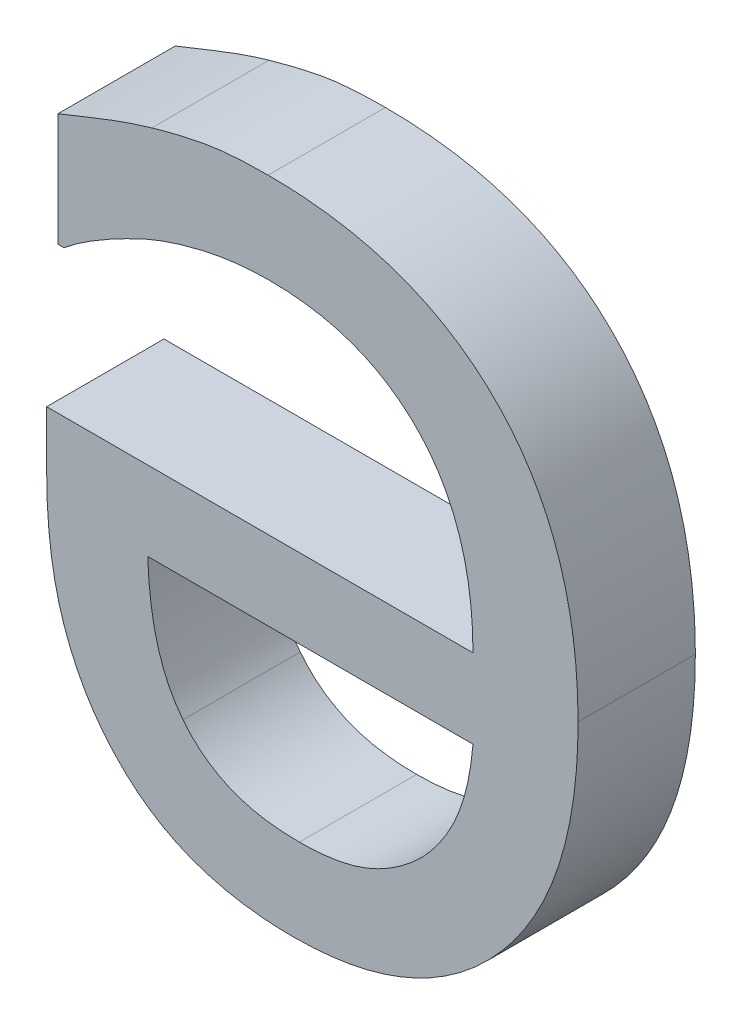
ISO-10303-21;
HEADER;
FILE_DESCRIPTION(('STEP AP214'),'2;1');
FILE_NAME('part.step','',(''),(''),'','','');
FILE_SCHEMA(('AUTOMOTIVE_DESIGN { 1 0 10303 214 1 1 1 1 }'));
ENDSEC;
DATA;
#1=APPLICATION_CONTEXT('core data for automotive mechanical design processes');
#2=APPLICATION_PROTOCOL_DEFINITION('international standard','automotive_design',2000,#1);
#3=PRODUCT_CONTEXT('',#1,'mechanical');
#4=PRODUCT('Part','Part','',(#3));
#5=PRODUCT_RELATED_PRODUCT_CATEGORY('part','',(#4));
#6=PRODUCT_DEFINITION_FORMATION('','',#4);
#7=PRODUCT_DEFINITION_CONTEXT('part definition',#1,'design');
#8=PRODUCT_DEFINITION('design','',#6,#7);
#9=PRODUCT_DEFINITION_SHAPE('','',#8);
#10=(LENGTH_UNIT() NAMED_UNIT(*) SI_UNIT(.MILLI.,.METRE.));
#11=(NAMED_UNIT(*) PLANE_ANGLE_UNIT() SI_UNIT($,.RADIAN.));
#12=(NAMED_UNIT(*) SI_UNIT($,.STERADIAN.) SOLID_ANGLE_UNIT());
#13=UNCERTAINTY_MEASURE_WITH_UNIT(LENGTH_MEASURE(1.E-05),#10,'distance_accuracy_value','');
#14=(GEOMETRIC_REPRESENTATION_CONTEXT(3) GLOBAL_UNCERTAINTY_ASSIGNED_CONTEXT((#13)) GLOBAL_UNIT_ASSIGNED_CONTEXT((#10,
#11,#12)) REPRESENTATION_CONTEXT('',''));
#15=CARTESIAN_POINT('',(0.,0.,0.));
#16=DIRECTION('',(0.,0.,1.));
#17=DIRECTION('',(1.,0.,0.));
#18=AXIS2_PLACEMENT_3D('',#15,#16,#17);
#19=CARTESIAN_POINT('',(-1.006263459883,0.963367809254916,0.));
#20=DIRECTION('',(0.,1.,0.));
#21=DIRECTION('',(-1.,0.,0.));
#22=AXIS2_PLACEMENT_3D('',#19,#20,#21);
#23=PLANE('',#22);
#24=DIRECTION('',(-1.,0.,0.));
#25=VECTOR('',#24,1.);
#26=CARTESIAN_POINT('',(-1.080322980316,0.963367809254916,0.));
#27=LINE('',#26,#25);
#28=CARTESIAN_POINT('',(-1.006263459883,0.963367809254916,0.));
#29=VERTEX_POINT('',#28);
#30=CARTESIAN_POINT('',(-1.283590671454,0.963367809254916,0.));
#31=VERTEX_POINT('',#30);
#32=EDGE_CURVE('E11',#29,#31,#27,.T.);
#33=ORIENTED_EDGE('',*,*,#32,.F.);
#34=DIRECTION('',(0.,0.,1.));
#35=VECTOR('',#34,1.);
#36=CARTESIAN_POINT('',(-1.006263459883,0.963367809254916,0.));
#37=LINE('',#36,#35);
#38=CARTESIAN_POINT('',(-1.006263459883,0.963367809254916,0.1));
#39=VERTEX_POINT('',#38);
#40=EDGE_CURVE('E24',#29,#39,#37,.T.);
#41=ORIENTED_EDGE('',*,*,#40,.T.);
#42=DIRECTION('',(1.,0.,0.));
#43=VECTOR('',#42,1.);
#44=CARTESIAN_POINT('',(-1.080322980316,0.963367809254916,0.1));
#45=LINE('',#44,#43);
#46=CARTESIAN_POINT('',(-1.283590671454,0.963367809254916,0.1));
#47=VERTEX_POINT('',#46);
#48=EDGE_CURVE('E414',#47,#39,#45,.T.);
#49=ORIENTED_EDGE('',*,*,#48,.F.);
#50=DIRECTION('',(0.,0.,1.));
#51=VECTOR('',#50,1.);
#52=CARTESIAN_POINT('',(-1.283590671454,0.963367809254916,0.));
#53=LINE('',#52,#51);
#54=EDGE_CURVE('E408',#31,#47,#53,.T.);
#55=ORIENTED_EDGE('',*,*,#54,.F.);
#56=EDGE_LOOP('',(#33,#41,#49,#55));
#57=FACE_BOUND('',#56,.T.);
#58=ADVANCED_FACE('F17',(#57),#23,.F.);
#59=CARTESIAN_POINT('',(-1.049365439596,0.858448516533894,0.));
#60=CARTESIAN_POINT('',(-1.049365439596,0.858448516533894,0.1));
#61=CARTESIAN_POINT('',(-1.029515843675,0.879432375078099,0.));
#62=CARTESIAN_POINT('',(-1.029515843675,0.879432375078099,0.1));
#63=CARTESIAN_POINT('',(-1.009099116443,0.92990706184659,0.));
#64=CARTESIAN_POINT('',(-1.009099116443,0.92990706184659,0.1));
#65=CARTESIAN_POINT('',(-1.006263459883,0.963367809254916,0.));
#66=CARTESIAN_POINT('',(-1.006263459883,0.963367809254916,0.1));
#67=B_SPLINE_SURFACE_WITH_KNOTS('',2,1,((#59,#60),(#61,#62),(#63,#64),(#65,#66)),.UNSPECIFIED.,
.F.,.F.,.F.,(3,1,3),(2,2),(0.,1.,2.),(0.,0.01),.UNSPECIFIED.);
#68=CARTESIAN_POINT('',(-1.049365439596,0.858448516533894,0.));
#69=CARTESIAN_POINT('',(-1.029515843675,0.879432375078099,0.));
#70=CARTESIAN_POINT('',(-1.009099116443,0.92990706184659,0.));
#71=CARTESIAN_POINT('',(-1.006263459883,0.963367809254916,0.));
#72=B_SPLINE_CURVE_WITH_KNOTS('',2,(#68,#69,#70,#71),.UNSPECIFIED.,.F.,.F.,(3,1,3),(0.,1.,2.),.UNSPECIFIED.);
#73=CARTESIAN_POINT('',(-1.049365439596,0.858448516533894,0.));
#74=VERTEX_POINT('',#73);
#75=EDGE_CURVE('E404',#74,#29,#72,.T.);
#76=DIRECTION('',(0.,0.,1.));
#77=VECTOR('',#76,1.);
#78=CARTESIAN_POINT('',(-1.049365439596,0.858448516533894,0.));
#79=LINE('',#78,#77);
#80=CARTESIAN_POINT('',(-1.049365439596,0.858448516533894,0.1));
#81=VERTEX_POINT('',#80);
#82=EDGE_CURVE('E398',#74,#81,#79,.T.);
#83=CARTESIAN_POINT('',(-1.006263459883,0.963367809254916,0.1));
#84=CARTESIAN_POINT('',(-1.009099116443,0.92990706184659,0.1));
#85=CARTESIAN_POINT('',(-1.029515843675,0.879432375078099,0.1));
#86=CARTESIAN_POINT('',(-1.049365439596,0.858448516533894,0.1));
#87=B_SPLINE_CURVE_WITH_KNOTS('',2,(#83,#84,#85,#86),.UNSPECIFIED.,.F.,.F.,(3,1,3),(-2.,-1.,0.),.UNSPECIFIED.);
#88=EDGE_CURVE('E391',#39,#81,#87,.T.);
#89=ORIENTED_EDGE('',*,*,#75,.F.);
#90=ORIENTED_EDGE('',*,*,#82,.T.);
#91=ORIENTED_EDGE('',*,*,#88,.F.);
#92=ORIENTED_EDGE('',*,*,#40,.F.);
#93=EDGE_LOOP('',(#89,#90,#91,#92));
#94=FACE_BOUND('',#93,.T.);
#95=ADVANCED_FACE('F420',(#94),#67,.F.);
#96=CARTESIAN_POINT('',(-1.154284732317,0.817047930757491,0.));
#97=CARTESIAN_POINT('',(-1.154284732317,0.817047930757491,0.1));
#98=CARTESIAN_POINT('',(-1.119122590972,0.817047930757491,0.));
#99=CARTESIAN_POINT('',(-1.119122590972,0.817047930757491,0.1));
#100=CARTESIAN_POINT('',(-1.069782166828,0.838031789301695,0.));
#101=CARTESIAN_POINT('',(-1.069782166828,0.838031789301695,0.1));
#102=CARTESIAN_POINT('',(-1.049365439596,0.858448516533894,0.));
#103=CARTESIAN_POINT('',(-1.049365439596,0.858448516533894,0.1));
#104=B_SPLINE_SURFACE_WITH_KNOTS('',2,1,((#96,#97),(#98,#99),(#100,#101),(#102,#103)),
.UNSPECIFIED.,.F.,.F.,.F.,(3,1,3),(2,2),(0.,1.,2.),(0.,0.01),.UNSPECIFIED.);
#105=CARTESIAN_POINT('',(-1.154284732317,0.817047930757491,0.));
#106=CARTESIAN_POINT('',(-1.119122590972,0.817047930757491,0.));
#107=CARTESIAN_POINT('',(-1.069782166828,0.838031789301695,0.));
#108=CARTESIAN_POINT('',(-1.049365439596,0.858448516533894,0.));
#109=B_SPLINE_CURVE_WITH_KNOTS('',2,(#105,#106,#107,#108),.UNSPECIFIED.,.F.,.F.,(3,1,3),(0.,1.,
2.),.UNSPECIFIED.);
#110=CARTESIAN_POINT('',(-1.154284732317,0.817047930757491,0.));
#111=VERTEX_POINT('',#110);
#112=EDGE_CURVE('E386',#111,#74,#109,.T.);
#113=DIRECTION('',(0.,0.,1.));
#114=VECTOR('',#113,1.);
#115=CARTESIAN_POINT('',(-1.154284732317,0.817047930757491,0.));
#116=LINE('',#115,#114);
#117=CARTESIAN_POINT('',(-1.154284732317,0.817047930757491,0.1));
#118=VERTEX_POINT('',#117);
#119=EDGE_CURVE('E380',#111,#118,#116,.T.);
#120=CARTESIAN_POINT('',(-1.049365439596,0.858448516533894,0.1));
#121=CARTESIAN_POINT('',(-1.069782166828,0.838031789301695,0.1));
#122=CARTESIAN_POINT('',(-1.119122590972,0.817047930757491,0.1));
#123=CARTESIAN_POINT('',(-1.154284732317,0.817047930757491,0.1));
#124=B_SPLINE_CURVE_WITH_KNOTS('',2,(#120,#121,#122,#123),.UNSPECIFIED.,.F.,.F.,(3,1,3),(-2.,
-1.,0.),.UNSPECIFIED.);
#125=EDGE_CURVE('E373',#81,#118,#124,.T.);
#126=ORIENTED_EDGE('',*,*,#112,.F.);
#127=ORIENTED_EDGE('',*,*,#119,.T.);
#128=ORIENTED_EDGE('',*,*,#125,.F.);
#129=ORIENTED_EDGE('',*,*,#82,.F.);
#130=EDGE_LOOP('',(#126,#127,#128,#129));
#131=FACE_BOUND('',#130,.T.);
#132=ADVANCED_FACE('F424',(#131),#104,.F.);
#133=CARTESIAN_POINT('',(-1.253532711918,0.857881385221889,0.));
#134=CARTESIAN_POINT('',(-1.253532711918,0.857881385221889,0.1));
#135=CARTESIAN_POINT('',(-1.238220166493,0.838031789301695,0.));
#136=CARTESIAN_POINT('',(-1.238220166493,0.838031789301695,0.1));
#137=CARTESIAN_POINT('',(-1.190014004973,0.817047930757491,0.));
#138=CARTESIAN_POINT('',(-1.190014004973,0.817047930757491,0.1));
#139=CARTESIAN_POINT('',(-1.154284732317,0.817047930757491,0.));
#140=CARTESIAN_POINT('',(-1.154284732317,0.817047930757491,0.1));
#141=B_SPLINE_SURFACE_WITH_KNOTS('',2,1,((#133,#134),(#135,#136),(#137,#138),(#139,#140)),
.UNSPECIFIED.,.F.,.F.,.F.,(3,1,3),(2,2),(0.,1.,2.),(0.,0.01),.UNSPECIFIED.);
#142=CARTESIAN_POINT('',(-1.253532711918,0.857881385221889,0.));
#143=CARTESIAN_POINT('',(-1.238220166493,0.838031789301695,0.));
#144=CARTESIAN_POINT('',(-1.190014004973,0.817047930757491,0.));
#145=CARTESIAN_POINT('',(-1.154284732317,0.817047930757491,0.));
#146=B_SPLINE_CURVE_WITH_KNOTS('',2,(#142,#143,#144,#145),.UNSPECIFIED.,.F.,.F.,(3,1,3),(0.,1.,
2.),.UNSPECIFIED.);
#147=CARTESIAN_POINT('',(-1.253532711918,0.857881385221889,0.));
#148=VERTEX_POINT('',#147);
#149=EDGE_CURVE('E368',#148,#111,#146,.T.);
#150=DIRECTION('',(0.,0.,1.));
#151=VECTOR('',#150,1.);
#152=CARTESIAN_POINT('',(-1.253532711918,0.857881385221889,0.));
#153=LINE('',#152,#151);
#154=CARTESIAN_POINT('',(-1.253532711918,0.857881385221889,0.1));
#155=VERTEX_POINT('',#154);
#156=EDGE_CURVE('E362',#148,#155,#153,.T.);
#157=CARTESIAN_POINT('',(-1.154284732317,0.817047930757491,0.1));
#158=CARTESIAN_POINT('',(-1.190014004973,0.817047930757491,0.1));
#159=CARTESIAN_POINT('',(-1.238220166493,0.838031789301695,0.1));
#160=CARTESIAN_POINT('',(-1.253532711918,0.857881385221889,0.1));
#161=B_SPLINE_CURVE_WITH_KNOTS('',2,(#157,#158,#159,#160),.UNSPECIFIED.,.F.,.F.,(3,1,3),(-2.,
-1.,0.),.UNSPECIFIED.);
#162=EDGE_CURVE('E355',#118,#155,#161,.T.);
#163=ORIENTED_EDGE('',*,*,#149,.F.);
#164=ORIENTED_EDGE('',*,*,#156,.T.);
#165=ORIENTED_EDGE('',*,*,#162,.F.);
#166=ORIENTED_EDGE('',*,*,#119,.F.);
#167=EDGE_LOOP('',(#163,#164,#165,#166));
#168=FACE_BOUND('',#167,.T.);
#169=ADVANCED_FACE('F428',(#168),#141,.F.);
#170=CARTESIAN_POINT('',(-1.283590671454,0.963367809254916,0.));
#171=CARTESIAN_POINT('',(-1.283590671454,0.963367809254916,0.1));
#172=CARTESIAN_POINT('',(-1.28245640883,0.927638536598568,0.));
#173=CARTESIAN_POINT('',(-1.28245640883,0.927638536598568,0.1));
#174=CARTESIAN_POINT('',(-1.267710994718,0.87546245589406,0.));
#175=CARTESIAN_POINT('',(-1.267710994718,0.87546245589406,0.1));
#176=CARTESIAN_POINT('',(-1.253532711918,0.857881385221889,0.));
#177=CARTESIAN_POINT('',(-1.253532711918,0.857881385221889,0.1));
#178=B_SPLINE_SURFACE_WITH_KNOTS('',2,1,((#170,#171),(#172,#173),(#174,#175),(#176,#177)),
.UNSPECIFIED.,.F.,.F.,.F.,(3,1,3),(2,2),(0.,1.,2.),(0.,0.01),.UNSPECIFIED.);
#179=CARTESIAN_POINT('',(-1.283590671454,0.963367809254916,0.));
#180=CARTESIAN_POINT('',(-1.28245640883,0.927638536598568,0.));
#181=CARTESIAN_POINT('',(-1.267710994718,0.87546245589406,0.));
#182=CARTESIAN_POINT('',(-1.253532711918,0.857881385221889,0.));
#183=B_SPLINE_CURVE_WITH_KNOTS('',2,(#179,#180,#181,#182),.UNSPECIFIED.,.F.,.F.,(3,1,3),(0.,1.,
2.),.UNSPECIFIED.);
#184=EDGE_CURVE('E348',#31,#148,#183,.T.);
#185=CARTESIAN_POINT('',(-1.253532711918,0.857881385221889,0.1));
#186=CARTESIAN_POINT('',(-1.267710994718,0.87546245589406,0.1));
#187=CARTESIAN_POINT('',(-1.28245640883,0.927638536598568,0.1));
#188=CARTESIAN_POINT('',(-1.283590671454,0.963367809254916,0.1));
#189=B_SPLINE_CURVE_WITH_KNOTS('',2,(#185,#186,#187,#188),.UNSPECIFIED.,.F.,.F.,(3,1,3),(-2.,
-1.,0.),.UNSPECIFIED.);
#190=EDGE_CURVE('E340',#155,#47,#189,.T.);
#191=ORIENTED_EDGE('',*,*,#184,.F.);
#192=ORIENTED_EDGE('',*,*,#54,.T.);
#193=ORIENTED_EDGE('',*,*,#190,.F.);
#194=ORIENTED_EDGE('',*,*,#156,.F.);
#195=EDGE_LOOP('',(#191,#192,#193,#194));
#196=FACE_BOUND('',#195,.T.);
#197=ADVANCED_FACE('F431',(#196),#178,.F.);
#198=CARTESIAN_POINT('',(-1.159388914125,0.744455122820784,0.));
#199=CARTESIAN_POINT('',(-1.159388914125,0.744455122820784,0.1));
#200=CARTESIAN_POINT('',(-1.051066833532,0.744455122820784,0.));
#201=CARTESIAN_POINT('',(-1.051066833532,0.744455122820784,0.1));
#202=CARTESIAN_POINT('',(-0.916656712586257,0.896446314438265,0.));
#203=CARTESIAN_POINT('',(-0.916656712586257,0.896446314438265,0.1));
#204=CARTESIAN_POINT('',(-0.916656712586257,1.024617990952,0.));
#205=CARTESIAN_POINT('',(-0.916656712586257,1.024617990952,0.1));
#206=B_SPLINE_SURFACE_WITH_KNOTS('',2,1,((#198,#199),(#200,#201),(#202,#203),(#204,#205)),
.UNSPECIFIED.,.F.,.F.,.F.,(3,1,3),(2,2),(-2.,-1.,0.),(0.,0.01),.UNSPECIFIED.);
#207=CARTESIAN_POINT('',(-0.916656712586257,1.024617990952,0.));
#208=CARTESIAN_POINT('',(-0.916656712586257,0.896446314438265,0.));
#209=CARTESIAN_POINT('',(-1.051066833532,0.744455122820784,0.));
#210=CARTESIAN_POINT('',(-1.159388914125,0.744455122820784,0.));
#211=B_SPLINE_CURVE_WITH_KNOTS('',2,(#207,#208,#209,#210),.UNSPECIFIED.,.F.,.F.,(3,1,3),(0.,1.,
2.),.UNSPECIFIED.);
#212=CARTESIAN_POINT('',(-0.916656712586257,1.024617990952,0.));
#213=VERTEX_POINT('',#212);
#214=CARTESIAN_POINT('',(-1.159388914125,0.744455122820784,0.));
#215=VERTEX_POINT('',#214);
#216=EDGE_CURVE('E336',#213,#215,#211,.T.);
#217=DIRECTION('',(0.,0.,1.));
#218=VECTOR('',#217,1.);
#219=CARTESIAN_POINT('',(-0.916656712586257,1.024617990952,0.));
#220=LINE('',#219,#218);
#221=CARTESIAN_POINT('',(-0.916656712586257,1.024617990952,0.1));
#222=VERTEX_POINT('',#221);
#223=EDGE_CURVE('E331',#213,#222,#220,.T.);
#224=CARTESIAN_POINT('',(-1.159388914125,0.744455122820784,0.1));
#225=CARTESIAN_POINT('',(-1.051066833532,0.744455122820784,0.1));
#226=CARTESIAN_POINT('',(-0.916656712586257,0.896446314438265,0.1));
#227=CARTESIAN_POINT('',(-0.916656712586257,1.024617990952,0.1));
#228=B_SPLINE_CURVE_WITH_KNOTS('',2,(#224,#225,#226,#227),.UNSPECIFIED.,.F.,.F.,(3,1,3),(-2.,
-1.,0.),.UNSPECIFIED.);
#229=CARTESIAN_POINT('',(-1.159388914125,0.744455122820784,0.1));
#230=VERTEX_POINT('',#229);
#231=EDGE_CURVE('E164',#230,#222,#228,.T.);
#232=DIRECTION('',(0.,0.,1.));
#233=VECTOR('',#232,1.);
#234=CARTESIAN_POINT('',(-1.159388914125,0.744455122820784,0.));
#235=LINE('',#234,#233);
#236=EDGE_CURVE('E322',#215,#230,#235,.T.);
#237=ORIENTED_EDGE('',*,*,#216,.F.);
#238=ORIENTED_EDGE('',*,*,#223,.T.);
#239=ORIENTED_EDGE('',*,*,#231,.F.);
#240=ORIENTED_EDGE('',*,*,#236,.F.);
#241=EDGE_LOOP('',(#237,#238,#239,#240));
#242=FACE_BOUND('',#241,.T.);
#243=ADVANCED_FACE('F479',(#242),#206,.T.);
#244=CARTESIAN_POINT('',(-1.311380105742,0.802869647957353,0.));
#245=CARTESIAN_POINT('',(-1.311380105742,0.802869647957353,0.1));
#246=CARTESIAN_POINT('',(-1.283590671454,0.77281168842106,0.));
#247=CARTESIAN_POINT('',(-1.283590671454,0.77281168842106,0.1));
#248=CARTESIAN_POINT('',(-1.208162206957,0.744455122820784,0.));
#249=CARTESIAN_POINT('',(-1.208162206957,0.744455122820784,0.1));
#250=CARTESIAN_POINT('',(-1.159388914125,0.744455122820784,0.));
#251=CARTESIAN_POINT('',(-1.159388914125,0.744455122820784,0.1));
#252=B_SPLINE_SURFACE_WITH_KNOTS('',2,1,((#244,#245),(#246,#247),(#248,#249),(#250,#251)),
.UNSPECIFIED.,.F.,.F.,.F.,(3,1,3),(2,2),(-2.,-1.,0.),(0.,0.01),.UNSPECIFIED.);
#253=CARTESIAN_POINT('',(-1.159388914125,0.744455122820784,0.));
#254=CARTESIAN_POINT('',(-1.208162206957,0.744455122820784,0.));
#255=CARTESIAN_POINT('',(-1.283590671454,0.77281168842106,0.));
#256=CARTESIAN_POINT('',(-1.311380105742,0.802869647957353,0.));
#257=B_SPLINE_CURVE_WITH_KNOTS('',2,(#253,#254,#255,#256),.UNSPECIFIED.,.F.,.F.,(3,1,3),(0.,1.,
2.),.UNSPECIFIED.);
#258=CARTESIAN_POINT('',(-1.311380105742,0.802869647957353,0.));
#259=VERTEX_POINT('',#258);
#260=EDGE_CURVE('E315',#215,#259,#257,.T.);
#261=CARTESIAN_POINT('',(-1.311380105742,0.802869647957353,0.1));
#262=CARTESIAN_POINT('',(-1.283590671454,0.77281168842106,0.1));
#263=CARTESIAN_POINT('',(-1.208162206957,0.744455122820784,0.1));
#264=CARTESIAN_POINT('',(-1.159388914125,0.744455122820784,0.1));
#265=B_SPLINE_CURVE_WITH_KNOTS('',2,(#261,#262,#263,#264),.UNSPECIFIED.,.F.,.F.,(3,1,3),(-2.,
-1.,0.),.UNSPECIFIED.);
#266=CARTESIAN_POINT('',(-1.311380105742,0.802869647957353,0.1));
#267=VERTEX_POINT('',#266);
#268=EDGE_CURVE('E311',#267,#230,#265,.T.);
#269=DIRECTION('',(0.,0.,1.));
#270=VECTOR('',#269,1.);
#271=CARTESIAN_POINT('',(-1.311380105742,0.802869647957353,0.));
#272=LINE('',#271,#270);
#273=EDGE_CURVE('E305',#259,#267,#272,.T.);
#274=ORIENTED_EDGE('',*,*,#260,.F.);
#275=ORIENTED_EDGE('',*,*,#236,.T.);
#276=ORIENTED_EDGE('',*,*,#268,.F.);
#277=ORIENTED_EDGE('',*,*,#273,.F.);
#278=EDGE_LOOP('',(#274,#275,#276,#277));
#279=FACE_BOUND('',#278,.T.);
#280=ADVANCED_FACE('F489',(#279),#252,.T.);
#281=CARTESIAN_POINT('',(-1.369794630879,0.982650273863104,0.));
#282=CARTESIAN_POINT('',(-1.369794630879,0.982650273863104,0.1));
#283=CARTESIAN_POINT('',(-1.369794630879,0.919698698230491,0.));
#284=CARTESIAN_POINT('',(-1.369794630879,0.919698698230491,0.1));
#285=CARTESIAN_POINT('',(-1.339736671342,0.832927607493646,0.));
#286=CARTESIAN_POINT('',(-1.339736671342,0.832927607493646,0.1));
#287=CARTESIAN_POINT('',(-1.311380105742,0.802869647957353,0.));
#288=CARTESIAN_POINT('',(-1.311380105742,0.802869647957353,0.1));
#289=B_SPLINE_SURFACE_WITH_KNOTS('',2,1,((#281,#282),(#283,#284),(#285,#286),(#287,#288)),
.UNSPECIFIED.,.F.,.F.,.F.,(3,1,3),(2,2),(-2.,-1.,0.),(0.,0.01),.UNSPECIFIED.);
#290=CARTESIAN_POINT('',(-1.311380105742,0.802869647957353,0.));
#291=CARTESIAN_POINT('',(-1.339736671342,0.832927607493646,0.));
#292=CARTESIAN_POINT('',(-1.369794630879,0.919698698230491,0.));
#293=CARTESIAN_POINT('',(-1.369794630879,0.982650273863104,0.));
#294=B_SPLINE_CURVE_WITH_KNOTS('',2,(#290,#291,#292,#293),.UNSPECIFIED.,.F.,.F.,(3,1,3),(0.,1.,
2.),.UNSPECIFIED.);
#295=CARTESIAN_POINT('',(-1.369794630879,0.982650273863104,0.));
#296=VERTEX_POINT('',#295);
#297=EDGE_CURVE('E298',#259,#296,#294,.T.);
#298=CARTESIAN_POINT('',(-1.369794630879,0.982650273863104,0.1));
#299=CARTESIAN_POINT('',(-1.369794630879,0.919698698230491,0.1));
#300=CARTESIAN_POINT('',(-1.339736671342,0.832927607493646,0.1));
#301=CARTESIAN_POINT('',(-1.311380105742,0.802869647957353,0.1));
#302=B_SPLINE_CURVE_WITH_KNOTS('',2,(#298,#299,#300,#301),.UNSPECIFIED.,.F.,.F.,(3,1,3),(-2.,
-1.,0.),.UNSPECIFIED.);
#303=CARTESIAN_POINT('',(-1.369794630879,0.982650273863104,0.1));
#304=VERTEX_POINT('',#303);
#305=EDGE_CURVE('E293',#304,#267,#302,.T.);
#306=DIRECTION('',(0.,0.,1.));
#307=VECTOR('',#306,1.);
#308=CARTESIAN_POINT('',(-1.369794630879,0.982650273863104,0.));
#309=LINE('',#308,#307);
#310=EDGE_CURVE('E290',#296,#304,#309,.T.);
#311=ORIENTED_EDGE('',*,*,#297,.F.);
#312=ORIENTED_EDGE('',*,*,#273,.T.);
#313=ORIENTED_EDGE('',*,*,#305,.F.);
#314=ORIENTED_EDGE('',*,*,#310,.F.);
#315=EDGE_LOOP('',(#311,#312,#313,#314));
#316=FACE_BOUND('',#315,.T.);
#317=ADVANCED_FACE('F500',(#316),#289,.T.);
#318=CARTESIAN_POINT('',(-1.369794630879,1.030856435384,0.));
#319=DIRECTION('',(-1.,0.,0.));
#320=DIRECTION('',(0.,-1.,0.));
#321=AXIS2_PLACEMENT_3D('',#318,#319,#320);
#322=PLANE('',#321);
#323=DIRECTION('',(0.,1.,0.));
#324=VECTOR('',#323,1.);
#325=CARTESIAN_POINT('',(-1.369794630879,0.982650273863104,0.));
#326=LINE('',#325,#324);
#327=CARTESIAN_POINT('',(-1.369794630879,1.030856435384,0.));
#328=VERTEX_POINT('',#327);
#329=EDGE_CURVE('E288',#296,#328,#326,.T.);
#330=ORIENTED_EDGE('',*,*,#329,.F.);
#331=ORIENTED_EDGE('',*,*,#310,.T.);
#332=DIRECTION('',(0.,-1.,0.));
#333=VECTOR('',#332,1.);
#334=CARTESIAN_POINT('',(-1.369794630879,0.982650273863104,0.1));
#335=LINE('',#334,#333);
#336=CARTESIAN_POINT('',(-1.369794630879,1.030856435384,0.1));
#337=VERTEX_POINT('',#336);
#338=EDGE_CURVE('E285',#337,#304,#335,.T.);
#339=ORIENTED_EDGE('',*,*,#338,.F.);
#340=DIRECTION('',(0.,0.,1.));
#341=VECTOR('',#340,1.);
#342=CARTESIAN_POINT('',(-1.369794630879,1.030856435384,0.));
#343=LINE('',#342,#341);
#344=EDGE_CURVE('E282',#328,#337,#343,.T.);
#345=ORIENTED_EDGE('',*,*,#344,.F.);
#346=EDGE_LOOP('',(#330,#331,#339,#345));
#347=FACE_BOUND('',#346,.T.);
#348=ADVANCED_FACE('F511',(#347),#322,.T.);
#349=CARTESIAN_POINT('',(-1.006263459883,1.030856435384,0.));
#350=DIRECTION('',(0.,1.,0.));
#351=DIRECTION('',(-1.,0.,0.));
#352=AXIS2_PLACEMENT_3D('',#349,#350,#351);
#353=PLANE('',#352);
#354=DIRECTION('',(1.,0.,0.));
#355=VECTOR('',#354,1.);
#356=CARTESIAN_POINT('',(-1.369794630879,1.030856435384,0.));
#357=LINE('',#356,#355);
#358=CARTESIAN_POINT('',(-1.006263459883,1.030856435384,0.));
#359=VERTEX_POINT('',#358);
#360=EDGE_CURVE('E280',#328,#359,#357,.T.);
#361=ORIENTED_EDGE('',*,*,#360,.F.);
#362=ORIENTED_EDGE('',*,*,#344,.T.);
#363=DIRECTION('',(-1.,0.,0.));
#364=VECTOR('',#363,1.);
#365=CARTESIAN_POINT('',(-1.369794630879,1.030856435384,0.1));
#366=LINE('',#365,#364);
#367=CARTESIAN_POINT('',(-1.006263459883,1.030856435384,0.1));
#368=VERTEX_POINT('',#367);
#369=EDGE_CURVE('E277',#368,#337,#366,.T.);
#370=ORIENTED_EDGE('',*,*,#369,.F.);
#371=DIRECTION('',(0.,0.,1.));
#372=VECTOR('',#371,1.);
#373=CARTESIAN_POINT('',(-1.006263459883,1.030856435384,0.));
#374=LINE('',#373,#372);
#375=EDGE_CURVE('E271',#359,#368,#374,.T.);
#376=ORIENTED_EDGE('',*,*,#375,.F.);
#377=EDGE_LOOP('',(#361,#362,#370,#376));
#378=FACE_BOUND('',#377,.T.);
#379=ADVANCED_FACE('F520',(#378),#353,.T.);
#380=CARTESIAN_POINT('',(-1.179805641357,1.219144030969,0.));
#381=CARTESIAN_POINT('',(-1.179805641357,1.219144030969,0.1));
#382=CARTESIAN_POINT('',(-1.098138732428,1.219144030969,0.));
#383=CARTESIAN_POINT('',(-1.098138732428,1.219144030969,0.1));
#384=CARTESIAN_POINT('',(-1.006263459883,1.122164576616,0.));
#385=CARTESIAN_POINT('',(-1.006263459883,1.122164576616,0.1));
#386=CARTESIAN_POINT('',(-1.006263459883,1.030856435384,0.));
#387=CARTESIAN_POINT('',(-1.006263459883,1.030856435384,0.1));
#388=B_SPLINE_SURFACE_WITH_KNOTS('',2,1,((#380,#381),(#382,#383),(#384,#385),(#386,#387)),
.UNSPECIFIED.,.F.,.F.,.F.,(3,1,3),(2,2),(-2.,-1.,0.),(0.,0.01),.UNSPECIFIED.);
#389=CARTESIAN_POINT('',(-1.006263459883,1.030856435384,0.));
#390=CARTESIAN_POINT('',(-1.006263459883,1.122164576616,0.));
#391=CARTESIAN_POINT('',(-1.098138732428,1.219144030969,0.));
#392=CARTESIAN_POINT('',(-1.179805641357,1.219144030969,0.));
#393=B_SPLINE_CURVE_WITH_KNOTS('',2,(#389,#390,#391,#392),.UNSPECIFIED.,.F.,.F.,(3,1,3),(0.,1.,
2.),.UNSPECIFIED.);
#394=CARTESIAN_POINT('',(-1.179805641357,1.219144030969,0.));
#395=VERTEX_POINT('',#394);
#396=EDGE_CURVE('E264',#359,#395,#393,.T.);
#397=CARTESIAN_POINT('',(-1.179805641357,1.219144030969,0.1));
#398=CARTESIAN_POINT('',(-1.098138732428,1.219144030969,0.1));
#399=CARTESIAN_POINT('',(-1.006263459883,1.122164576616,0.1));
#400=CARTESIAN_POINT('',(-1.006263459883,1.030856435384,0.1));
#401=B_SPLINE_CURVE_WITH_KNOTS('',2,(#397,#398,#399,#400),.UNSPECIFIED.,.F.,.F.,(3,1,3),(-2.,
-1.,0.),.UNSPECIFIED.);
#402=CARTESIAN_POINT('',(-1.179805641357,1.219144030969,0.1));
#403=VERTEX_POINT('',#402);
#404=EDGE_CURVE('E259',#403,#368,#401,.T.);
#405=DIRECTION('',(0.,0.,1.));
#406=VECTOR('',#405,1.);
#407=CARTESIAN_POINT('',(-1.179805641357,1.219144030969,0.));
#408=LINE('',#407,#406);
#409=EDGE_CURVE('E253',#395,#403,#408,.T.);
#410=ORIENTED_EDGE('',*,*,#396,.F.);
#411=ORIENTED_EDGE('',*,*,#375,.T.);
#412=ORIENTED_EDGE('',*,*,#404,.F.);
#413=ORIENTED_EDGE('',*,*,#409,.F.);
#414=EDGE_LOOP('',(#410,#411,#412,#413));
#415=FACE_BOUND('',#414,.T.);
#416=ADVANCED_FACE('F524',(#415),#388,.T.);
#417=CARTESIAN_POINT('',(-1.287560590638,1.195891647177,0.));
#418=CARTESIAN_POINT('',(-1.287560590638,1.195891647177,0.1));
#419=CARTESIAN_POINT('',(-1.264875338158,1.206100010793,0.));
#420=CARTESIAN_POINT('',(-1.264875338158,1.206100010793,0.1));
#421=CARTESIAN_POINT('',(-1.208729338269,1.219144030969,0.));
#422=CARTESIAN_POINT('',(-1.208729338269,1.219144030969,0.1));
#423=CARTESIAN_POINT('',(-1.179805641357,1.219144030969,0.));
#424=CARTESIAN_POINT('',(-1.179805641357,1.219144030969,0.1));
#425=B_SPLINE_SURFACE_WITH_KNOTS('',2,1,((#417,#418),(#419,#420),(#421,#422),(#423,#424)),
.UNSPECIFIED.,.F.,.F.,.F.,(3,1,3),(2,2),(-2.,-1.,0.),(0.,0.01),.UNSPECIFIED.);
#426=CARTESIAN_POINT('',(-1.179805641357,1.219144030969,0.));
#427=CARTESIAN_POINT('',(-1.208729338269,1.219144030969,0.));
#428=CARTESIAN_POINT('',(-1.264875338158,1.206100010793,0.));
#429=CARTESIAN_POINT('',(-1.287560590638,1.195891647177,0.));
#430=B_SPLINE_CURVE_WITH_KNOTS('',2,(#426,#427,#428,#429),.UNSPECIFIED.,.F.,.F.,(3,1,3),(0.,1.,
2.),.UNSPECIFIED.);
#431=CARTESIAN_POINT('',(-1.287560590638,1.195891647177,0.));
#432=VERTEX_POINT('',#431);
#433=EDGE_CURVE('E246',#395,#432,#430,.T.);
#434=CARTESIAN_POINT('',(-1.287560590638,1.195891647177,0.1));
#435=CARTESIAN_POINT('',(-1.264875338158,1.206100010793,0.1));
#436=CARTESIAN_POINT('',(-1.208729338269,1.219144030969,0.1));
#437=CARTESIAN_POINT('',(-1.179805641357,1.219144030969,0.1));
#438=B_SPLINE_CURVE_WITH_KNOTS('',2,(#434,#435,#436,#437),.UNSPECIFIED.,.F.,.F.,(3,1,3),(-2.,
-1.,0.),.UNSPECIFIED.);
#439=CARTESIAN_POINT('',(-1.287560590638,1.195891647177,0.1));
#440=VERTEX_POINT('',#439);
#441=EDGE_CURVE('E241',#440,#403,#438,.T.);
#442=DIRECTION('',(0.,0.,1.));
#443=VECTOR('',#442,1.);
#444=CARTESIAN_POINT('',(-1.287560590638,1.195891647177,0.));
#445=LINE('',#444,#443);
#446=EDGE_CURVE('E235',#432,#440,#445,.T.);
#447=ORIENTED_EDGE('',*,*,#433,.F.);
#448=ORIENTED_EDGE('',*,*,#409,.T.);
#449=ORIENTED_EDGE('',*,*,#441,.F.);
#450=ORIENTED_EDGE('',*,*,#446,.F.);
#451=EDGE_LOOP('',(#447,#448,#449,#450));
#452=FACE_BOUND('',#451,.T.);
#453=ADVANCED_FACE('F530',(#452),#425,.T.);
#454=CARTESIAN_POINT('',(-1.355049216767,1.155625324025,0.));
#455=CARTESIAN_POINT('',(-1.355049216767,1.155625324025,0.1));
#456=CARTESIAN_POINT('',(-1.344273721838,1.164699425017,0.));
#457=CARTESIAN_POINT('',(-1.344273721838,1.164699425017,0.1));
#458=CARTESIAN_POINT('',(-1.311380105742,1.184549020937,0.));
#459=CARTESIAN_POINT('',(-1.311380105742,1.184549020937,0.1));
#460=CARTESIAN_POINT('',(-1.287560590638,1.195891647177,0.));
#461=CARTESIAN_POINT('',(-1.287560590638,1.195891647177,0.1));
#462=B_SPLINE_SURFACE_WITH_KNOTS('',2,1,((#454,#455),(#456,#457),(#458,#459),(#460,#461)),
.UNSPECIFIED.,.F.,.F.,.F.,(3,1,3),(2,2),(-2.,-1.,0.),(0.,0.01),.UNSPECIFIED.);
#463=CARTESIAN_POINT('',(-1.287560590638,1.195891647177,0.));
#464=CARTESIAN_POINT('',(-1.311380105742,1.184549020937,0.));
#465=CARTESIAN_POINT('',(-1.344273721838,1.164699425017,0.));
#466=CARTESIAN_POINT('',(-1.355049216767,1.155625324025,0.));
#467=B_SPLINE_CURVE_WITH_KNOTS('',2,(#463,#464,#465,#466),.UNSPECIFIED.,.F.,.F.,(3,1,3),(0.,1.,
2.),.UNSPECIFIED.);
#468=CARTESIAN_POINT('',(-1.355049216767,1.155625324025,0.));
#469=VERTEX_POINT('',#468);
#470=EDGE_CURVE('E228',#432,#469,#467,.T.);
#471=CARTESIAN_POINT('',(-1.355049216767,1.155625324025,0.1));
#472=CARTESIAN_POINT('',(-1.344273721838,1.164699425017,0.1));
#473=CARTESIAN_POINT('',(-1.311380105742,1.184549020937,0.1));
#474=CARTESIAN_POINT('',(-1.287560590638,1.195891647177,0.1));
#475=B_SPLINE_CURVE_WITH_KNOTS('',2,(#471,#472,#473,#474),.UNSPECIFIED.,.F.,.F.,(3,1,3),(-2.,
-1.,0.),.UNSPECIFIED.);
#476=CARTESIAN_POINT('',(-1.355049216767,1.155625324025,0.1));
#477=VERTEX_POINT('',#476);
#478=EDGE_CURVE('E223',#477,#440,#475,.T.);
#479=DIRECTION('',(0.,0.,1.));
#480=VECTOR('',#479,1.);
#481=CARTESIAN_POINT('',(-1.355049216767,1.155625324025,0.));
#482=LINE('',#481,#480);
#483=EDGE_CURVE('E220',#469,#477,#482,.T.);
#484=ORIENTED_EDGE('',*,*,#470,.F.);
#485=ORIENTED_EDGE('',*,*,#446,.T.);
#486=ORIENTED_EDGE('',*,*,#478,.F.);
#487=ORIENTED_EDGE('',*,*,#483,.F.);
#488=EDGE_LOOP('',(#484,#485,#486,#487));
#489=FACE_BOUND('',#488,.T.);
#490=ADVANCED_FACE('F541',(#489),#462,.T.);
#491=CARTESIAN_POINT('',(-1.360153398575,1.155625324025,0.));
#492=DIRECTION('',(0.,-1.,0.));
#493=DIRECTION('',(1.,0.,0.));
#494=AXIS2_PLACEMENT_3D('',#491,#492,#493);
#495=PLANE('',#494);
#496=DIRECTION('',(-1.,0.,0.));
#497=VECTOR('',#496,1.);
#498=CARTESIAN_POINT('',(-1.355049216767,1.155625324025,0.));
#499=LINE('',#498,#497);
#500=CARTESIAN_POINT('',(-1.360153398575,1.155625324025,0.));
#501=VERTEX_POINT('',#500);
#502=EDGE_CURVE('E218',#469,#501,#499,.T.);
#503=ORIENTED_EDGE('',*,*,#502,.F.);
#504=ORIENTED_EDGE('',*,*,#483,.T.);
#505=DIRECTION('',(1.,0.,0.));
#506=VECTOR('',#505,1.);
#507=CARTESIAN_POINT('',(-1.355049216767,1.155625324025,0.1));
#508=LINE('',#507,#506);
#509=CARTESIAN_POINT('',(-1.360153398575,1.155625324025,0.1));
#510=VERTEX_POINT('',#509);
#511=EDGE_CURVE('E215',#510,#477,#508,.T.);
#512=ORIENTED_EDGE('',*,*,#511,.F.);
#513=DIRECTION('',(0.,0.,1.));
#514=VECTOR('',#513,1.);
#515=CARTESIAN_POINT('',(-1.360153398575,1.155625324025,0.));
#516=LINE('',#515,#514);
#517=EDGE_CURVE('E212',#501,#510,#516,.T.);
#518=ORIENTED_EDGE('',*,*,#517,.F.);
#519=EDGE_LOOP('',(#503,#504,#512,#518));
#520=FACE_BOUND('',#519,.T.);
#521=ADVANCED_FACE('F552',(#520),#495,.T.);
#522=CARTESIAN_POINT('',(-1.360153398575,1.252037647066,0.));
#523=DIRECTION('',(-1.,0.,0.));
#524=DIRECTION('',(0.,-1.,0.));
#525=AXIS2_PLACEMENT_3D('',#522,#523,#524);
#526=PLANE('',#525);
#527=DIRECTION('',(0.,1.,0.));
#528=VECTOR('',#527,1.);
#529=CARTESIAN_POINT('',(-1.360153398575,1.155625324025,0.));
#530=LINE('',#529,#528);
#531=CARTESIAN_POINT('',(-1.360153398575,1.252037647066,0.));
#532=VERTEX_POINT('',#531);
#533=EDGE_CURVE('E210',#501,#532,#530,.T.);
#534=ORIENTED_EDGE('',*,*,#533,.F.);
#535=ORIENTED_EDGE('',*,*,#517,.T.);
#536=DIRECTION('',(0.,-1.,0.));
#537=VECTOR('',#536,1.);
#538=CARTESIAN_POINT('',(-1.360153398575,1.155625324025,0.1));
#539=LINE('',#538,#537);
#540=CARTESIAN_POINT('',(-1.360153398575,1.252037647066,0.1));
#541=VERTEX_POINT('',#540);
#542=EDGE_CURVE('E207',#541,#510,#539,.T.);
#543=ORIENTED_EDGE('',*,*,#542,.F.);
#544=DIRECTION('',(0.,0.,1.));
#545=VECTOR('',#544,1.);
#546=CARTESIAN_POINT('',(-1.360153398575,1.252037647066,0.));
#547=LINE('',#546,#545);
#548=EDGE_CURVE('E201',#532,#541,#547,.T.);
#549=ORIENTED_EDGE('',*,*,#548,.F.);
#550=EDGE_LOOP('',(#534,#535,#543,#549));
#551=FACE_BOUND('',#550,.T.);
#552=ADVANCED_FACE('F561',(#551),#526,.T.);
#553=CARTESIAN_POINT('',(-1.280187883582,1.28152847529,0.));
#554=CARTESIAN_POINT('',(-1.280187883582,1.28152847529,0.1));
#555=CARTESIAN_POINT('',(-1.298336085566,1.276424293482,0.));
#556=CARTESIAN_POINT('',(-1.298336085566,1.276424293482,0.1));
#557=CARTESIAN_POINT('',(-1.34484085315,1.258276091498,0.));
#558=CARTESIAN_POINT('',(-1.34484085315,1.258276091498,0.1));
#559=CARTESIAN_POINT('',(-1.360153398575,1.252037647066,0.));
#560=CARTESIAN_POINT('',(-1.360153398575,1.252037647066,0.1));
#561=B_SPLINE_SURFACE_WITH_KNOTS('',2,1,((#553,#554),(#555,#556),(#557,#558),(#559,#560)),
.UNSPECIFIED.,.F.,.F.,.F.,(3,1,3),(2,2),(-2.,-1.,0.),(0.,0.01),.UNSPECIFIED.);
#562=CARTESIAN_POINT('',(-1.360153398575,1.252037647066,0.));
#563=CARTESIAN_POINT('',(-1.34484085315,1.258276091498,0.));
#564=CARTESIAN_POINT('',(-1.298336085566,1.276424293482,0.));
#565=CARTESIAN_POINT('',(-1.280187883582,1.28152847529,0.));
#566=B_SPLINE_CURVE_WITH_KNOTS('',2,(#562,#563,#564,#565),.UNSPECIFIED.,.F.,.F.,(3,1,3),(0.,1.,
2.),.UNSPECIFIED.);
#567=CARTESIAN_POINT('',(-1.280187883582,1.28152847529,0.));
#568=VERTEX_POINT('',#567);
#569=EDGE_CURVE('E194',#532,#568,#566,.T.);
#570=CARTESIAN_POINT('',(-1.280187883582,1.28152847529,0.1));
#571=CARTESIAN_POINT('',(-1.298336085566,1.276424293482,0.1));
#572=CARTESIAN_POINT('',(-1.34484085315,1.258276091498,0.1));
#573=CARTESIAN_POINT('',(-1.360153398575,1.252037647066,0.1));
#574=B_SPLINE_CURVE_WITH_KNOTS('',2,(#570,#571,#572,#573),.UNSPECIFIED.,.F.,.F.,(3,1,3),(-2.,
-1.,0.),.UNSPECIFIED.);
#575=CARTESIAN_POINT('',(-1.280187883582,1.28152847529,0.1));
#576=VERTEX_POINT('',#575);
#577=EDGE_CURVE('E190',#576,#541,#574,.T.);
#578=DIRECTION('',(0.,0.,1.));
#579=VECTOR('',#578,1.);
#580=CARTESIAN_POINT('',(-1.280187883582,1.28152847529,0.));
#581=LINE('',#580,#579);
#582=EDGE_CURVE('E146',#568,#576,#581,.T.);
#583=ORIENTED_EDGE('',*,*,#569,.F.);
#584=ORIENTED_EDGE('',*,*,#548,.T.);
#585=ORIENTED_EDGE('',*,*,#577,.F.);
#586=ORIENTED_EDGE('',*,*,#582,.F.);
#587=EDGE_LOOP('',(#583,#584,#585,#586));
#588=FACE_BOUND('',#587,.T.);
#589=ADVANCED_FACE('F565',(#588),#561,.T.);
#590=CARTESIAN_POINT('',(-1.180939903981,1.296273889402,0.));
#591=CARTESIAN_POINT('',(-1.180939903981,1.296273889402,0.1));
#592=CARTESIAN_POINT('',(-1.212699257453,1.296273889402,0.));
#593=CARTESIAN_POINT('',(-1.212699257453,1.296273889402,0.1));
#594=CARTESIAN_POINT('',(-1.254666974542,1.288901182346,0.));
#595=CARTESIAN_POINT('',(-1.254666974542,1.288901182346,0.1));
#596=CARTESIAN_POINT('',(-1.280187883582,1.28152847529,0.));
#597=CARTESIAN_POINT('',(-1.280187883582,1.28152847529,0.1));
#598=B_SPLINE_SURFACE_WITH_KNOTS('',2,1,((#590,#591),(#592,#593),(#594,#595),(#596,#597)),
.UNSPECIFIED.,.F.,.F.,.F.,(3,1,3),(2,2),(-2.,-1.,0.),(0.,0.01),.UNSPECIFIED.);
#599=CARTESIAN_POINT('',(-1.280187883582,1.28152847529,0.));
#600=CARTESIAN_POINT('',(-1.254666974542,1.288901182346,0.));
#601=CARTESIAN_POINT('',(-1.212699257453,1.296273889402,0.));
#602=CARTESIAN_POINT('',(-1.180939903981,1.296273889402,0.));
#603=B_SPLINE_CURVE_WITH_KNOTS('',2,(#599,#600,#601,#602),.UNSPECIFIED.,.F.,.F.,(3,1,3),(0.,1.,
2.),.UNSPECIFIED.);
#604=CARTESIAN_POINT('',(-1.180939903981,1.296273889402,0.));
#605=VERTEX_POINT('',#604);
#606=EDGE_CURVE('E150',#568,#605,#603,.T.);
#607=CARTESIAN_POINT('',(-1.180939903981,1.296273889402,0.1));
#608=CARTESIAN_POINT('',(-1.212699257453,1.296273889402,0.1));
#609=CARTESIAN_POINT('',(-1.254666974542,1.288901182346,0.1));
#610=CARTESIAN_POINT('',(-1.280187883582,1.28152847529,0.1));
#611=B_SPLINE_CURVE_WITH_KNOTS('',2,(#607,#608,#609,#610),.UNSPECIFIED.,.F.,.F.,(3,1,3),(-2.,
-1.,0.),.UNSPECIFIED.);
#612=CARTESIAN_POINT('',(-1.180939903981,1.296273889402,0.1));
#613=VERTEX_POINT('',#612);
#614=EDGE_CURVE('E139',#613,#576,#611,.T.);
#615=DIRECTION('',(0.,0.,1.));
#616=VECTOR('',#615,1.);
#617=CARTESIAN_POINT('',(-1.180939903981,1.296273889402,0.));
#618=LINE('',#617,#616);
#619=EDGE_CURVE('E143',#605,#613,#618,.T.);
#620=ORIENTED_EDGE('',*,*,#606,.F.);
#621=ORIENTED_EDGE('',*,*,#582,.T.);
#622=ORIENTED_EDGE('',*,*,#614,.F.);
#623=ORIENTED_EDGE('',*,*,#619,.F.);
#624=EDGE_LOOP('',(#620,#621,#622,#623));
#625=FACE_BOUND('',#624,.T.);
#626=ADVANCED_FACE('F142',(#625),#598,.T.);
#627=CARTESIAN_POINT('',(-0.916656712586257,1.024617990952,0.));
#628=CARTESIAN_POINT('',(-0.916656712586257,1.024617990952,0.1));
#629=CARTESIAN_POINT('',(-0.916656712586257,1.155058192713,0.));
#630=CARTESIAN_POINT('',(-0.916656712586257,1.155058192713,0.1));
#631=CARTESIAN_POINT('',(-1.055036752716,1.296273889402,0.));
#632=CARTESIAN_POINT('',(-1.055036752716,1.296273889402,0.1));
#633=CARTESIAN_POINT('',(-1.180939903981,1.296273889402,0.));
#634=CARTESIAN_POINT('',(-1.180939903981,1.296273889402,0.1));
#635=B_SPLINE_SURFACE_WITH_KNOTS('',2,1,((#627,#628),(#629,#630),(#631,#632),(#633,#634)),
.UNSPECIFIED.,.F.,.F.,.F.,(3,1,3),(2,2),(-2.,-1.,0.),(0.,0.01),.UNSPECIFIED.);
#636=CARTESIAN_POINT('',(-1.180939903981,1.296273889402,0.));
#637=CARTESIAN_POINT('',(-1.055036752716,1.296273889402,0.));
#638=CARTESIAN_POINT('',(-0.916656712586257,1.155058192713,0.));
#639=CARTESIAN_POINT('',(-0.916656712586257,1.024617990952,0.));
#640=B_SPLINE_CURVE_WITH_KNOTS('',2,(#636,#637,#638,#639),.UNSPECIFIED.,.F.,.F.,(3,1,3),(0.,1.,
2.),.UNSPECIFIED.);
#641=EDGE_CURVE('E158',#605,#213,#640,.T.);
#642=CARTESIAN_POINT('',(-0.916656712586257,1.024617990952,0.1));
#643=CARTESIAN_POINT('',(-0.916656712586257,1.155058192713,0.1));
#644=CARTESIAN_POINT('',(-1.055036752716,1.296273889402,0.1));
#645=CARTESIAN_POINT('',(-1.180939903981,1.296273889402,0.1));
#646=B_SPLINE_CURVE_WITH_KNOTS('',2,(#642,#643,#644,#645),.UNSPECIFIED.,.F.,.F.,(3,1,3),(-2.,
-1.,0.),.UNSPECIFIED.);
#647=EDGE_CURVE('E156',#222,#613,#646,.T.);
#648=ORIENTED_EDGE('',*,*,#641,.F.);
#649=ORIENTED_EDGE('',*,*,#619,.T.);
#650=ORIENTED_EDGE('',*,*,#647,.F.);
#651=ORIENTED_EDGE('',*,*,#223,.F.);
#652=EDGE_LOOP('',(#648,#649,#650,#651));
#653=FACE_BOUND('',#652,.T.);
#654=ADVANCED_FACE('F154',(#653),#635,.T.);
#655=CARTESIAN_POINT('',(-1.154382500749,1.054043910781,0.));
#656=DIRECTION('',(0.,0.,1.));
#657=DIRECTION('',(1.,0.,0.));
#658=AXIS2_PLACEMENT_3D('',#655,#656,#657);
#659=PLANE('',#658);
#660=ORIENTED_EDGE('',*,*,#641,.T.);
#661=ORIENTED_EDGE('',*,*,#216,.T.);
#662=ORIENTED_EDGE('',*,*,#260,.T.);
#663=ORIENTED_EDGE('',*,*,#297,.T.);
#664=ORIENTED_EDGE('',*,*,#329,.T.);
#665=ORIENTED_EDGE('',*,*,#360,.T.);
#666=ORIENTED_EDGE('',*,*,#396,.T.);
#667=ORIENTED_EDGE('',*,*,#433,.T.);
#668=ORIENTED_EDGE('',*,*,#470,.T.);
#669=ORIENTED_EDGE('',*,*,#502,.T.);
#670=ORIENTED_EDGE('',*,*,#533,.T.);
#671=ORIENTED_EDGE('',*,*,#569,.T.);
#672=ORIENTED_EDGE('',*,*,#606,.T.);
#673=EDGE_LOOP('',(#660,#661,#662,#663,#664,#665,#666,#667,#668,#669,#670,#671,#672));
#674=FACE_BOUND('',#673,.T.);
#675=ORIENTED_EDGE('',*,*,#32,.T.);
#676=ORIENTED_EDGE('',*,*,#184,.T.);
#677=ORIENTED_EDGE('',*,*,#149,.T.);
#678=ORIENTED_EDGE('',*,*,#112,.T.);
#679=ORIENTED_EDGE('',*,*,#75,.T.);
#680=EDGE_LOOP('',(#675,#676,#677,#678,#679));
#681=FACE_BOUND('',#680,.T.);
#682=ADVANCED_FACE('F432',(#674,#681),#659,.F.);
#683=CARTESIAN_POINT('',(-1.154382500749,1.054043910781,0.1));
#684=DIRECTION('',(0.,0.,1.));
#685=DIRECTION('',(1.,0.,0.));
#686=AXIS2_PLACEMENT_3D('',#683,#684,#685);
#687=PLANE('',#686);
#688=ORIENTED_EDGE('',*,*,#647,.T.);
#689=ORIENTED_EDGE('',*,*,#614,.T.);
#690=ORIENTED_EDGE('',*,*,#577,.T.);
#691=ORIENTED_EDGE('',*,*,#542,.T.);
#692=ORIENTED_EDGE('',*,*,#511,.T.);
#693=ORIENTED_EDGE('',*,*,#478,.T.);
#694=ORIENTED_EDGE('',*,*,#441,.T.);
#695=ORIENTED_EDGE('',*,*,#404,.T.);
#696=ORIENTED_EDGE('',*,*,#369,.T.);
#697=ORIENTED_EDGE('',*,*,#338,.T.);
#698=ORIENTED_EDGE('',*,*,#305,.T.);
#699=ORIENTED_EDGE('',*,*,#268,.T.);
#700=ORIENTED_EDGE('',*,*,#231,.T.);
#701=EDGE_LOOP('',(#688,#689,#690,#691,#692,#693,#694,#695,#696,#697,#698,#699,#700));
#702=FACE_BOUND('',#701,.T.);
#703=ORIENTED_EDGE('',*,*,#48,.T.);
#704=ORIENTED_EDGE('',*,*,#88,.T.);
#705=ORIENTED_EDGE('',*,*,#125,.T.);
#706=ORIENTED_EDGE('',*,*,#162,.T.);
#707=ORIENTED_EDGE('',*,*,#190,.T.);
#708=EDGE_LOOP('',(#703,#704,#705,#706,#707));
#709=FACE_BOUND('',#708,.T.);
#710=ADVANCED_FACE('F161',(#702,#709),#687,.T.);
#711=CLOSED_SHELL('',(#58,#95,#132,#169,#197,#243,#280,#317,#348,#379,#416,#453,#490,#521,#552,
#589,#626,#654,#682,#710));
#712=MANIFOLD_SOLID_BREP('B1',#711);
#713=ADVANCED_BREP_SHAPE_REPRESENTATION('',(#18,#712),#14);
#714=SHAPE_DEFINITION_REPRESENTATION(#9,#713);
ENDSEC;
END-ISO-10303-21;
